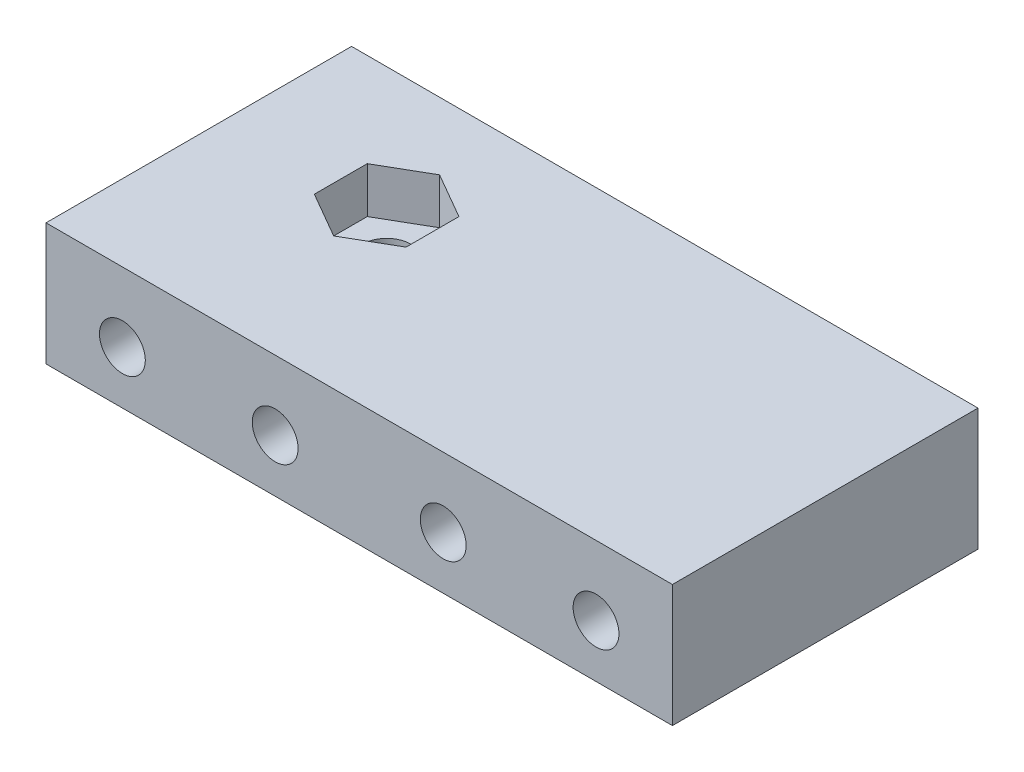
ISO-10303-21;
HEADER;
FILE_DESCRIPTION(('STEP AP214'),'2;1');
FILE_NAME('part.step','',(''),(''),'','','');
FILE_SCHEMA(('AUTOMOTIVE_DESIGN { 1 0 10303 214 1 1 1 1 }'));
ENDSEC;
DATA;
#1=APPLICATION_CONTEXT('core data for automotive mechanical design processes');
#2=APPLICATION_PROTOCOL_DEFINITION('international standard','automotive_design',2000,#1);
#3=PRODUCT_CONTEXT('',#1,'mechanical');
#4=PRODUCT('Part','Part','',(#3));
#5=PRODUCT_RELATED_PRODUCT_CATEGORY('part','',(#4));
#6=PRODUCT_DEFINITION_FORMATION('','',#4);
#7=PRODUCT_DEFINITION_CONTEXT('part definition',#1,'design');
#8=PRODUCT_DEFINITION('design','',#6,#7);
#9=PRODUCT_DEFINITION_SHAPE('','',#8);
#10=(LENGTH_UNIT() NAMED_UNIT(*) SI_UNIT(.MILLI.,.METRE.));
#11=(NAMED_UNIT(*) PLANE_ANGLE_UNIT() SI_UNIT($,.RADIAN.));
#12=(NAMED_UNIT(*) SI_UNIT($,.STERADIAN.) SOLID_ANGLE_UNIT());
#13=UNCERTAINTY_MEASURE_WITH_UNIT(LENGTH_MEASURE(1.E-05),#10,'distance_accuracy_value','');
#14=(GEOMETRIC_REPRESENTATION_CONTEXT(3) GLOBAL_UNCERTAINTY_ASSIGNED_CONTEXT((#13)) GLOBAL_UNIT_ASSIGNED_CONTEXT((#10,
#11,#12)) REPRESENTATION_CONTEXT('',''));
#15=CARTESIAN_POINT('',(0.,0.,0.));
#16=DIRECTION('',(0.,0.,1.));
#17=DIRECTION('',(1.,0.,0.));
#18=AXIS2_PLACEMENT_3D('',#15,#16,#17);
#19=CARTESIAN_POINT('',(10.16,8.,-12.135));
#20=DIRECTION('',(0.,-1.,0.));
#21=DIRECTION('',(0.,0.,-1.));
#22=AXIS2_PLACEMENT_3D('',#19,#20,#21);
#23=CYLINDRICAL_SURFACE('',#22,1.6);
#24=CARTESIAN_POINT('',(10.16,-2.5,-12.135));
#25=DIRECTION('',(0.,-1.,0.));
#26=DIRECTION('',(0.,0.,-1.));
#27=AXIS2_PLACEMENT_3D('',#24,#25,#26);
#28=CIRCLE('',#27,1.6);
#29=CARTESIAN_POINT('',(10.16,-2.5,-13.735));
#30=VERTEX_POINT('',#29);
#31=EDGE_CURVE('E173',#30,#30,#28,.T.);
#32=ORIENTED_EDGE('',*,*,#31,.T.);
#33=EDGE_LOOP('',(#32));
#34=FACE_BOUND('',#33,.T.);
#35=CARTESIAN_POINT('',(10.16,5.,-12.135));
#36=DIRECTION('',(0.,1.,0.));
#37=DIRECTION('',(0.,0.,1.));
#38=AXIS2_PLACEMENT_3D('',#35,#36,#37);
#39=CIRCLE('',#38,1.6);
#40=CARTESIAN_POINT('',(10.16,5.,-10.535));
#41=VERTEX_POINT('',#40);
#42=EDGE_CURVE('E36',#41,#41,#39,.T.);
#43=ORIENTED_EDGE('',*,*,#42,.T.);
#44=EDGE_LOOP('',(#43));
#45=FACE_BOUND('',#44,.T.);
#46=ADVANCED_FACE('F32',(#34,#45),#23,.F.);
#47=CARTESIAN_POINT('',(0.,0.,0.));
#48=DIRECTION('',(0.,-1.,0.));
#49=DIRECTION('',(0.,0.,-1.));
#50=AXIS2_PLACEMENT_3D('',#47,#48,#49);
#51=PLANE('',#50);
#52=DIRECTION('',(0.,0.,1.));
#53=VECTOR('',#52,1.);
#54=CARTESIAN_POINT('',(0.,0.,0.));
#55=LINE('',#54,#53);
#56=CARTESIAN_POINT('',(0.,0.,-20.));
#57=VERTEX_POINT('',#56);
#58=CARTESIAN_POINT('',(0.,0.,0.));
#59=VERTEX_POINT('',#58);
#60=EDGE_CURVE('E204',#57,#59,#55,.T.);
#61=ORIENTED_EDGE('',*,*,#60,.F.);
#62=DIRECTION('',(-1.,0.,0.));
#63=VECTOR('',#62,1.);
#64=CARTESIAN_POINT('',(0.,0.,-20.));
#65=LINE('',#64,#63);
#66=CARTESIAN_POINT('',(41.,0.,-20.));
#67=VERTEX_POINT('',#66);
#68=EDGE_CURVE('E78',#67,#57,#65,.T.);
#69=ORIENTED_EDGE('',*,*,#68,.F.);
#70=DIRECTION('',(0.,0.,-1.));
#71=VECTOR('',#70,1.);
#72=CARTESIAN_POINT('',(41.,0.,0.));
#73=LINE('',#72,#71);
#74=CARTESIAN_POINT('',(41.,0.,0.));
#75=VERTEX_POINT('',#74);
#76=EDGE_CURVE('E218',#75,#67,#73,.T.);
#77=ORIENTED_EDGE('',*,*,#76,.F.);
#78=DIRECTION('',(1.,0.,0.));
#79=VECTOR('',#78,1.);
#80=CARTESIAN_POINT('',(0.,0.,0.));
#81=LINE('',#80,#79);
#82=EDGE_CURVE('E216',#59,#75,#81,.T.);
#83=ORIENTED_EDGE('',*,*,#82,.F.);
#84=EDGE_LOOP('',(#61,#69,#77,#83));
#85=FACE_BOUND('',#84,.T.);
#86=CARTESIAN_POINT('',(10.16,0.,-12.135));
#87=DIRECTION('',(0.,-1.,0.));
#88=DIRECTION('',(0.,0.,-1.));
#89=AXIS2_PLACEMENT_3D('',#86,#87,#88);
#90=CIRCLE('',#89,3.5);
#91=CARTESIAN_POINT('',(10.16,0.,-15.635));
#92=VERTEX_POINT('',#91);
#93=EDGE_CURVE('E176',#92,#92,#90,.T.);
#94=ORIENTED_EDGE('',*,*,#93,.F.);
#95=EDGE_LOOP('',(#94));
#96=FACE_BOUND('',#95,.T.);
#97=ADVANCED_FACE('F232',(#85,#96),#51,.T.);
#98=CARTESIAN_POINT('',(0.,8.,0.));
#99=DIRECTION('',(1.,0.,0.));
#100=DIRECTION('',(0.,0.,-1.));
#101=AXIS2_PLACEMENT_3D('',#98,#99,#100);
#102=PLANE('',#101);
#103=ORIENTED_EDGE('',*,*,#60,.T.);
#104=DIRECTION('',(0.,-1.,0.));
#105=VECTOR('',#104,1.);
#106=CARTESIAN_POINT('',(0.,8.,0.));
#107=LINE('',#106,#105);
#108=CARTESIAN_POINT('',(0.,8.,0.));
#109=VERTEX_POINT('',#108);
#110=EDGE_CURVE('E11',#109,#59,#107,.T.);
#111=ORIENTED_EDGE('',*,*,#110,.F.);
#112=DIRECTION('',(0.,0.,1.));
#113=VECTOR('',#112,1.);
#114=CARTESIAN_POINT('',(0.,8.,0.));
#115=LINE('',#114,#113);
#116=CARTESIAN_POINT('',(0.,8.,-20.));
#117=VERTEX_POINT('',#116);
#118=EDGE_CURVE('E207',#117,#109,#115,.T.);
#119=ORIENTED_EDGE('',*,*,#118,.F.);
#120=DIRECTION('',(0.,-1.,0.));
#121=VECTOR('',#120,1.);
#122=CARTESIAN_POINT('',(0.,8.,-20.));
#123=LINE('',#122,#121);
#124=EDGE_CURVE('E213',#117,#57,#123,.T.);
#125=ORIENTED_EDGE('',*,*,#124,.T.);
#126=EDGE_LOOP('',(#103,#111,#119,#125));
#127=FACE_BOUND('',#126,.T.);
#128=ADVANCED_FACE('F34',(#127),#102,.F.);
#129=CARTESIAN_POINT('',(0.,8.,0.));
#130=DIRECTION('',(0.,0.,-1.));
#131=DIRECTION('',(-1.,0.,0.));
#132=AXIS2_PLACEMENT_3D('',#129,#130,#131);
#133=PLANE('',#132);
#134=CARTESIAN_POINT('',(36.,3.455,0.));
#135=DIRECTION('',(0.,0.,1.));
#136=DIRECTION('',(1.,0.,0.));
#137=AXIS2_PLACEMENT_3D('',#134,#135,#136);
#138=CIRCLE('',#137,1.5);
#139=CARTESIAN_POINT('',(37.5,3.455,0.));
#140=VERTEX_POINT('',#139);
#141=EDGE_CURVE('E180',#140,#140,#138,.T.);
#142=ORIENTED_EDGE('',*,*,#141,.F.);
#143=EDGE_LOOP('',(#142));
#144=FACE_BOUND('',#143,.T.);
#145=CARTESIAN_POINT('',(26.,3.455,0.));
#146=DIRECTION('',(0.,0.,1.));
#147=DIRECTION('',(1.,0.,0.));
#148=AXIS2_PLACEMENT_3D('',#145,#146,#147);
#149=CIRCLE('',#148,1.5);
#150=CARTESIAN_POINT('',(27.5,3.455,0.));
#151=VERTEX_POINT('',#150);
#152=EDGE_CURVE('E186',#151,#151,#149,.T.);
#153=ORIENTED_EDGE('',*,*,#152,.F.);
#154=EDGE_LOOP('',(#153));
#155=FACE_BOUND('',#154,.T.);
#156=CARTESIAN_POINT('',(15.,3.455,0.));
#157=DIRECTION('',(0.,0.,1.));
#158=DIRECTION('',(1.,0.,0.));
#159=AXIS2_PLACEMENT_3D('',#156,#157,#158);
#160=CIRCLE('',#159,1.5);
#161=CARTESIAN_POINT('',(16.5,3.455,0.));
#162=VERTEX_POINT('',#161);
#163=EDGE_CURVE('E192',#162,#162,#160,.T.);
#164=ORIENTED_EDGE('',*,*,#163,.F.);
#165=EDGE_LOOP('',(#164));
#166=FACE_BOUND('',#165,.T.);
#167=CARTESIAN_POINT('',(5.,3.455,0.));
#168=DIRECTION('',(0.,0.,1.));
#169=DIRECTION('',(1.,0.,0.));
#170=AXIS2_PLACEMENT_3D('',#167,#168,#169);
#171=CIRCLE('',#170,1.5);
#172=CARTESIAN_POINT('',(6.5,3.455,0.));
#173=VERTEX_POINT('',#172);
#174=EDGE_CURVE('E198',#173,#173,#171,.T.);
#175=ORIENTED_EDGE('',*,*,#174,.F.);
#176=EDGE_LOOP('',(#175));
#177=FACE_BOUND('',#176,.T.);
#178=ORIENTED_EDGE('',*,*,#82,.T.);
#179=DIRECTION('',(0.,-1.,0.));
#180=VECTOR('',#179,1.);
#181=CARTESIAN_POINT('',(41.,8.,0.));
#182=LINE('',#181,#180);
#183=CARTESIAN_POINT('',(41.,8.,0.));
#184=VERTEX_POINT('',#183);
#185=EDGE_CURVE('E41',#184,#75,#182,.T.);
#186=ORIENTED_EDGE('',*,*,#185,.F.);
#187=DIRECTION('',(1.,0.,0.));
#188=VECTOR('',#187,1.);
#189=CARTESIAN_POINT('',(0.,8.,0.));
#190=LINE('',#189,#188);
#191=EDGE_CURVE('E85',#109,#184,#190,.T.);
#192=ORIENTED_EDGE('',*,*,#191,.F.);
#193=ORIENTED_EDGE('',*,*,#110,.T.);
#194=EDGE_LOOP('',(#178,#186,#192,#193));
#195=FACE_BOUND('',#194,.T.);
#196=ADVANCED_FACE('F249',(#144,#155,#166,#177,#195),#133,.F.);
#197=CARTESIAN_POINT('',(41.,8.,0.));
#198=DIRECTION('',(-1.,0.,0.));
#199=DIRECTION('',(0.,0.,1.));
#200=AXIS2_PLACEMENT_3D('',#197,#198,#199);
#201=PLANE('',#200);
#202=ORIENTED_EDGE('',*,*,#76,.T.);
#203=DIRECTION('',(0.,-1.,0.));
#204=VECTOR('',#203,1.);
#205=CARTESIAN_POINT('',(41.,8.,-20.));
#206=LINE('',#205,#204);
#207=CARTESIAN_POINT('',(41.,8.,-20.));
#208=VERTEX_POINT('',#207);
#209=EDGE_CURVE('E222',#208,#67,#206,.T.);
#210=ORIENTED_EDGE('',*,*,#209,.F.);
#211=DIRECTION('',(0.,0.,-1.));
#212=VECTOR('',#211,1.);
#213=CARTESIAN_POINT('',(41.,8.,0.));
#214=LINE('',#213,#212);
#215=EDGE_CURVE('E210',#184,#208,#214,.T.);
#216=ORIENTED_EDGE('',*,*,#215,.F.);
#217=ORIENTED_EDGE('',*,*,#185,.T.);
#218=EDGE_LOOP('',(#202,#210,#216,#217));
#219=FACE_BOUND('',#218,.T.);
#220=ADVANCED_FACE('F228',(#219),#201,.F.);
#221=CARTESIAN_POINT('',(0.,8.,-20.));
#222=DIRECTION('',(0.,0.,1.));
#223=DIRECTION('',(1.,0.,0.));
#224=AXIS2_PLACEMENT_3D('',#221,#222,#223);
#225=PLANE('',#224);
#226=CARTESIAN_POINT('',(36.,3.455,-20.));
#227=DIRECTION('',(0.,0.,1.));
#228=DIRECTION('',(1.,0.,0.));
#229=AXIS2_PLACEMENT_3D('',#226,#227,#228);
#230=CIRCLE('',#229,1.5);
#231=CARTESIAN_POINT('',(37.5,3.455,-20.));
#232=VERTEX_POINT('',#231);
#233=EDGE_CURVE('E183',#232,#232,#230,.T.);
#234=ORIENTED_EDGE('',*,*,#233,.T.);
#235=EDGE_LOOP('',(#234));
#236=FACE_BOUND('',#235,.T.);
#237=CARTESIAN_POINT('',(26.,3.455,-20.));
#238=DIRECTION('',(0.,0.,1.));
#239=DIRECTION('',(1.,0.,0.));
#240=AXIS2_PLACEMENT_3D('',#237,#238,#239);
#241=CIRCLE('',#240,1.5);
#242=CARTESIAN_POINT('',(27.5,3.455,-20.));
#243=VERTEX_POINT('',#242);
#244=EDGE_CURVE('E189',#243,#243,#241,.T.);
#245=ORIENTED_EDGE('',*,*,#244,.T.);
#246=EDGE_LOOP('',(#245));
#247=FACE_BOUND('',#246,.T.);
#248=CARTESIAN_POINT('',(15.,3.455,-20.));
#249=DIRECTION('',(0.,0.,1.));
#250=DIRECTION('',(1.,0.,0.));
#251=AXIS2_PLACEMENT_3D('',#248,#249,#250);
#252=CIRCLE('',#251,1.5);
#253=CARTESIAN_POINT('',(16.5,3.455,-20.));
#254=VERTEX_POINT('',#253);
#255=EDGE_CURVE('E195',#254,#254,#252,.T.);
#256=ORIENTED_EDGE('',*,*,#255,.T.);
#257=EDGE_LOOP('',(#256));
#258=FACE_BOUND('',#257,.T.);
#259=CARTESIAN_POINT('',(5.,3.455,-20.));
#260=DIRECTION('',(0.,0.,1.));
#261=DIRECTION('',(1.,0.,0.));
#262=AXIS2_PLACEMENT_3D('',#259,#260,#261);
#263=CIRCLE('',#262,1.5);
#264=CARTESIAN_POINT('',(6.5,3.455,-20.));
#265=VERTEX_POINT('',#264);
#266=EDGE_CURVE('E201',#265,#265,#263,.T.);
#267=ORIENTED_EDGE('',*,*,#266,.T.);
#268=EDGE_LOOP('',(#267));
#269=FACE_BOUND('',#268,.T.);
#270=ORIENTED_EDGE('',*,*,#68,.T.);
#271=ORIENTED_EDGE('',*,*,#124,.F.);
#272=DIRECTION('',(-1.,0.,0.));
#273=VECTOR('',#272,1.);
#274=CARTESIAN_POINT('',(0.,8.,-20.));
#275=LINE('',#274,#273);
#276=EDGE_CURVE('E57',#208,#117,#275,.T.);
#277=ORIENTED_EDGE('',*,*,#276,.F.);
#278=ORIENTED_EDGE('',*,*,#209,.T.);
#279=EDGE_LOOP('',(#270,#271,#277,#278));
#280=FACE_BOUND('',#279,.T.);
#281=ADVANCED_FACE('F237',(#236,#247,#258,#269,#280),#225,.F.);
#282=CARTESIAN_POINT('',(0.,8.,0.));
#283=DIRECTION('',(0.,-1.,0.));
#284=DIRECTION('',(0.,0.,-1.));
#285=AXIS2_PLACEMENT_3D('',#282,#283,#284);
#286=PLANE('',#285);
#287=DIRECTION('',(0.866025403784439,0.,0.5));
#288=VECTOR('',#287,1.);
#289=CARTESIAN_POINT('',(7.16,8.,-10.4029491924311));
#290=LINE('',#289,#288);
#291=CARTESIAN_POINT('',(7.16,8.,-10.4029491924311));
#292=VERTEX_POINT('',#291);
#293=CARTESIAN_POINT('',(10.16,8.,-8.67089838486224));
#294=VERTEX_POINT('',#293);
#295=EDGE_CURVE('E154',#292,#294,#290,.T.);
#296=ORIENTED_EDGE('',*,*,#295,.F.);
#297=DIRECTION('',(0.,0.,1.));
#298=VECTOR('',#297,1.);
#299=CARTESIAN_POINT('',(7.16,8.,-13.8670508075689));
#300=LINE('',#299,#298);
#301=CARTESIAN_POINT('',(7.16,8.,-13.8670508075689));
#302=VERTEX_POINT('',#301);
#303=EDGE_CURVE('E48',#302,#292,#300,.T.);
#304=ORIENTED_EDGE('',*,*,#303,.F.);
#305=DIRECTION('',(-0.866025403784438,0.,0.5));
#306=VECTOR('',#305,1.);
#307=CARTESIAN_POINT('',(10.16,8.,-15.5991016151378));
#308=LINE('',#307,#306);
#309=CARTESIAN_POINT('',(10.16,8.,-15.5991016151378));
#310=VERTEX_POINT('',#309);
#311=EDGE_CURVE('E140',#310,#302,#308,.T.);
#312=ORIENTED_EDGE('',*,*,#311,.F.);
#313=DIRECTION('',(-0.866025403784439,0.,-0.5));
#314=VECTOR('',#313,1.);
#315=CARTESIAN_POINT('',(13.16,8.,-13.8670508075689));
#316=LINE('',#315,#314);
#317=CARTESIAN_POINT('',(13.16,8.,-13.8670508075689));
#318=VERTEX_POINT('',#317);
#319=EDGE_CURVE('E143',#318,#310,#316,.T.);
#320=ORIENTED_EDGE('',*,*,#319,.F.);
#321=DIRECTION('',(0.,0.,-1.));
#322=VECTOR('',#321,1.);
#323=CARTESIAN_POINT('',(13.16,8.,-10.4029491924311));
#324=LINE('',#323,#322);
#325=CARTESIAN_POINT('',(13.16,8.,-10.4029491924311));
#326=VERTEX_POINT('',#325);
#327=EDGE_CURVE('E159',#326,#318,#324,.T.);
#328=ORIENTED_EDGE('',*,*,#327,.F.);
#329=DIRECTION('',(0.866025403784438,0.,-0.5));
#330=VECTOR('',#329,1.);
#331=CARTESIAN_POINT('',(10.16,8.,-8.67089838486224));
#332=LINE('',#331,#330);
#333=EDGE_CURVE('E156',#294,#326,#332,.T.);
#334=ORIENTED_EDGE('',*,*,#333,.F.);
#335=EDGE_LOOP('',(#296,#304,#312,#320,#328,#334));
#336=FACE_BOUND('',#335,.T.);
#337=ORIENTED_EDGE('',*,*,#118,.T.);
#338=ORIENTED_EDGE('',*,*,#191,.T.);
#339=ORIENTED_EDGE('',*,*,#215,.T.);
#340=ORIENTED_EDGE('',*,*,#276,.T.);
#341=EDGE_LOOP('',(#337,#338,#339,#340));
#342=FACE_BOUND('',#341,.T.);
#343=ADVANCED_FACE('F239',(#336,#342),#286,.F.);
#344=CARTESIAN_POINT('',(5.,3.455,-20.));
#345=DIRECTION('',(0.,0.,1.));
#346=DIRECTION('',(1.,0.,0.));
#347=AXIS2_PLACEMENT_3D('',#344,#345,#346);
#348=CYLINDRICAL_SURFACE('',#347,1.5);
#349=ORIENTED_EDGE('',*,*,#266,.F.);
#350=EDGE_LOOP('',(#349));
#351=FACE_BOUND('',#350,.T.);
#352=ORIENTED_EDGE('',*,*,#174,.T.);
#353=EDGE_LOOP('',(#352));
#354=FACE_BOUND('',#353,.T.);
#355=ADVANCED_FACE('F246',(#351,#354),#348,.F.);
#356=CARTESIAN_POINT('',(15.,3.455,-20.));
#357=DIRECTION('',(0.,0.,1.));
#358=DIRECTION('',(1.,0.,0.));
#359=AXIS2_PLACEMENT_3D('',#356,#357,#358);
#360=CYLINDRICAL_SURFACE('',#359,1.5);
#361=ORIENTED_EDGE('',*,*,#255,.F.);
#362=EDGE_LOOP('',(#361));
#363=FACE_BOUND('',#362,.T.);
#364=ORIENTED_EDGE('',*,*,#163,.T.);
#365=EDGE_LOOP('',(#364));
#366=FACE_BOUND('',#365,.T.);
#367=ADVANCED_FACE('F272',(#363,#366),#360,.F.);
#368=CARTESIAN_POINT('',(26.,3.455,-20.));
#369=DIRECTION('',(0.,0.,1.));
#370=DIRECTION('',(1.,0.,0.));
#371=AXIS2_PLACEMENT_3D('',#368,#369,#370);
#372=CYLINDRICAL_SURFACE('',#371,1.5);
#373=ORIENTED_EDGE('',*,*,#244,.F.);
#374=EDGE_LOOP('',(#373));
#375=FACE_BOUND('',#374,.T.);
#376=ORIENTED_EDGE('',*,*,#152,.T.);
#377=EDGE_LOOP('',(#376));
#378=FACE_BOUND('',#377,.T.);
#379=ADVANCED_FACE('F268',(#375,#378),#372,.F.);
#380=CARTESIAN_POINT('',(36.,3.455,-20.));
#381=DIRECTION('',(0.,0.,1.));
#382=DIRECTION('',(1.,0.,0.));
#383=AXIS2_PLACEMENT_3D('',#380,#381,#382);
#384=CYLINDRICAL_SURFACE('',#383,1.5);
#385=ORIENTED_EDGE('',*,*,#233,.F.);
#386=EDGE_LOOP('',(#385));
#387=FACE_BOUND('',#386,.T.);
#388=ORIENTED_EDGE('',*,*,#141,.T.);
#389=EDGE_LOOP('',(#388));
#390=FACE_BOUND('',#389,.T.);
#391=ADVANCED_FACE('F264',(#387,#390),#384,.F.);
#392=CARTESIAN_POINT('',(10.16,-2.5,-12.135));
#393=DIRECTION('',(0.,-1.,0.));
#394=DIRECTION('',(0.,0.,-1.));
#395=AXIS2_PLACEMENT_3D('',#392,#393,#394);
#396=PLANE('',#395);
#397=CARTESIAN_POINT('',(10.16,-2.5,-12.135));
#398=DIRECTION('',(0.,-1.,0.));
#399=DIRECTION('',(0.,0.,-1.));
#400=AXIS2_PLACEMENT_3D('',#397,#398,#399);
#401=CIRCLE('',#400,3.5);
#402=CARTESIAN_POINT('',(10.16,-2.5,-15.635));
#403=VERTEX_POINT('',#402);
#404=EDGE_CURVE('E177',#403,#403,#401,.T.);
#405=ORIENTED_EDGE('',*,*,#404,.T.);
#406=EDGE_LOOP('',(#405));
#407=FACE_BOUND('',#406,.T.);
#408=ORIENTED_EDGE('',*,*,#31,.F.);
#409=EDGE_LOOP('',(#408));
#410=FACE_BOUND('',#409,.T.);
#411=ADVANCED_FACE('F267',(#407,#410),#396,.T.);
#412=CARTESIAN_POINT('',(10.16,-2.5,-12.135));
#413=DIRECTION('',(0.,1.,0.));
#414=DIRECTION('',(0.,0.,1.));
#415=AXIS2_PLACEMENT_3D('',#412,#413,#414);
#416=CYLINDRICAL_SURFACE('',#415,3.5);
#417=ORIENTED_EDGE('',*,*,#404,.F.);
#418=EDGE_LOOP('',(#417));
#419=FACE_BOUND('',#418,.T.);
#420=ORIENTED_EDGE('',*,*,#93,.T.);
#421=EDGE_LOOP('',(#420));
#422=FACE_BOUND('',#421,.T.);
#423=ADVANCED_FACE('F262',(#419,#422),#416,.T.);
#424=CARTESIAN_POINT('',(7.16,5.,-13.8670508075689));
#425=DIRECTION('',(-1.,0.,0.));
#426=DIRECTION('',(0.,0.,1.));
#427=AXIS2_PLACEMENT_3D('',#424,#425,#426);
#428=PLANE('',#427);
#429=ORIENTED_EDGE('',*,*,#303,.T.);
#430=DIRECTION('',(0.,1.,0.));
#431=VECTOR('',#430,1.);
#432=CARTESIAN_POINT('',(7.16,5.,-10.4029491924311));
#433=LINE('',#432,#431);
#434=CARTESIAN_POINT('',(7.16,5.,-10.4029491924311));
#435=VERTEX_POINT('',#434);
#436=EDGE_CURVE('E117',#435,#292,#433,.T.);
#437=ORIENTED_EDGE('',*,*,#436,.F.);
#438=DIRECTION('',(0.,0.,1.));
#439=VECTOR('',#438,1.);
#440=CARTESIAN_POINT('',(7.16,5.,-13.8670508075689));
#441=LINE('',#440,#439);
#442=CARTESIAN_POINT('',(7.16,5.,-13.8670508075689));
#443=VERTEX_POINT('',#442);
#444=EDGE_CURVE('E121',#443,#435,#441,.T.);
#445=ORIENTED_EDGE('',*,*,#444,.F.);
#446=DIRECTION('',(0.,1.,0.));
#447=VECTOR('',#446,1.);
#448=CARTESIAN_POINT('',(7.16,5.,-13.8670508075689));
#449=LINE('',#448,#447);
#450=EDGE_CURVE('E164',#443,#302,#449,.T.);
#451=ORIENTED_EDGE('',*,*,#450,.T.);
#452=EDGE_LOOP('',(#429,#437,#445,#451));
#453=FACE_BOUND('',#452,.T.);
#454=ADVANCED_FACE('F119',(#453),#428,.F.);
#455=CARTESIAN_POINT('',(10.16,5.,-15.5991016151378));
#456=DIRECTION('',(-0.5,0.,-0.866025403784438));
#457=DIRECTION('',(-0.866025403784439,0.,0.5));
#458=AXIS2_PLACEMENT_3D('',#455,#456,#457);
#459=PLANE('',#458);
#460=ORIENTED_EDGE('',*,*,#311,.T.);
#461=ORIENTED_EDGE('',*,*,#450,.F.);
#462=DIRECTION('',(-0.866025403784438,0.,0.5));
#463=VECTOR('',#462,1.);
#464=CARTESIAN_POINT('',(10.16,5.,-15.5991016151378));
#465=LINE('',#464,#463);
#466=CARTESIAN_POINT('',(10.16,5.,-15.5991016151378));
#467=VERTEX_POINT('',#466);
#468=EDGE_CURVE('E127',#467,#443,#465,.T.);
#469=ORIENTED_EDGE('',*,*,#468,.F.);
#470=DIRECTION('',(0.,1.,0.));
#471=VECTOR('',#470,1.);
#472=CARTESIAN_POINT('',(10.16,5.,-15.5991016151378));
#473=LINE('',#472,#471);
#474=EDGE_CURVE('E166',#467,#310,#473,.T.);
#475=ORIENTED_EDGE('',*,*,#474,.T.);
#476=EDGE_LOOP('',(#460,#461,#469,#475));
#477=FACE_BOUND('',#476,.T.);
#478=ADVANCED_FACE('F346',(#477),#459,.F.);
#479=CARTESIAN_POINT('',(13.16,5.,-13.8670508075689));
#480=DIRECTION('',(0.499999999999999,0.,-0.866025403784439));
#481=DIRECTION('',(-0.866025403784439,0.,-0.5));
#482=AXIS2_PLACEMENT_3D('',#479,#480,#481);
#483=PLANE('',#482);
#484=ORIENTED_EDGE('',*,*,#319,.T.);
#485=ORIENTED_EDGE('',*,*,#474,.F.);
#486=DIRECTION('',(-0.866025403784439,0.,-0.5));
#487=VECTOR('',#486,1.);
#488=CARTESIAN_POINT('',(13.16,5.,-13.8670508075689));
#489=LINE('',#488,#487);
#490=CARTESIAN_POINT('',(13.16,5.,-13.8670508075689));
#491=VERTEX_POINT('',#490);
#492=EDGE_CURVE('E150',#491,#467,#489,.T.);
#493=ORIENTED_EDGE('',*,*,#492,.F.);
#494=DIRECTION('',(0.,1.,0.));
#495=VECTOR('',#494,1.);
#496=CARTESIAN_POINT('',(13.16,5.,-13.8670508075689));
#497=LINE('',#496,#495);
#498=EDGE_CURVE('E168',#491,#318,#497,.T.);
#499=ORIENTED_EDGE('',*,*,#498,.T.);
#500=EDGE_LOOP('',(#484,#485,#493,#499));
#501=FACE_BOUND('',#500,.T.);
#502=ADVANCED_FACE('F355',(#501),#483,.F.);
#503=CARTESIAN_POINT('',(13.16,5.,-10.4029491924311));
#504=DIRECTION('',(1.,0.,0.));
#505=DIRECTION('',(0.,0.,-1.));
#506=AXIS2_PLACEMENT_3D('',#503,#504,#505);
#507=PLANE('',#506);
#508=ORIENTED_EDGE('',*,*,#327,.T.);
#509=ORIENTED_EDGE('',*,*,#498,.F.);
#510=DIRECTION('',(0.,0.,-1.));
#511=VECTOR('',#510,1.);
#512=CARTESIAN_POINT('',(13.16,5.,-10.4029491924311));
#513=LINE('',#512,#511);
#514=CARTESIAN_POINT('',(13.16,5.,-10.4029491924311));
#515=VERTEX_POINT('',#514);
#516=EDGE_CURVE('E147',#515,#491,#513,.T.);
#517=ORIENTED_EDGE('',*,*,#516,.F.);
#518=DIRECTION('',(0.,1.,0.));
#519=VECTOR('',#518,1.);
#520=CARTESIAN_POINT('',(13.16,5.,-10.4029491924311));
#521=LINE('',#520,#519);
#522=EDGE_CURVE('E170',#515,#326,#521,.T.);
#523=ORIENTED_EDGE('',*,*,#522,.T.);
#524=EDGE_LOOP('',(#508,#509,#517,#523));
#525=FACE_BOUND('',#524,.T.);
#526=ADVANCED_FACE('F365',(#525),#507,.F.);
#527=CARTESIAN_POINT('',(10.16,5.,-8.67089838486224));
#528=DIRECTION('',(0.5,0.,0.866025403784439));
#529=DIRECTION('',(0.866025403784439,0.,-0.5));
#530=AXIS2_PLACEMENT_3D('',#527,#528,#529);
#531=PLANE('',#530);
#532=ORIENTED_EDGE('',*,*,#333,.T.);
#533=ORIENTED_EDGE('',*,*,#522,.F.);
#534=DIRECTION('',(0.866025403784438,0.,-0.5));
#535=VECTOR('',#534,1.);
#536=CARTESIAN_POINT('',(10.16,5.,-8.67089838486224));
#537=LINE('',#536,#535);
#538=CARTESIAN_POINT('',(10.16,5.,-8.67089838486224));
#539=VERTEX_POINT('',#538);
#540=EDGE_CURVE('E135',#539,#515,#537,.T.);
#541=ORIENTED_EDGE('',*,*,#540,.F.);
#542=DIRECTION('',(0.,1.,0.));
#543=VECTOR('',#542,1.);
#544=CARTESIAN_POINT('',(10.16,5.,-8.67089838486224));
#545=LINE('',#544,#543);
#546=EDGE_CURVE('E126',#539,#294,#545,.T.);
#547=ORIENTED_EDGE('',*,*,#546,.T.);
#548=EDGE_LOOP('',(#532,#533,#541,#547));
#549=FACE_BOUND('',#548,.T.);
#550=ADVANCED_FACE('F375',(#549),#531,.F.);
#551=CARTESIAN_POINT('',(7.16,5.,-10.4029491924311));
#552=DIRECTION('',(-0.5,0.,0.866025403784439));
#553=DIRECTION('',(0.866025403784439,0.,0.5));
#554=AXIS2_PLACEMENT_3D('',#551,#552,#553);
#555=PLANE('',#554);
#556=ORIENTED_EDGE('',*,*,#295,.T.);
#557=ORIENTED_EDGE('',*,*,#546,.F.);
#558=DIRECTION('',(0.866025403784439,0.,0.5));
#559=VECTOR('',#558,1.);
#560=CARTESIAN_POINT('',(7.16,5.,-10.4029491924311));
#561=LINE('',#560,#559);
#562=EDGE_CURVE('E130',#435,#539,#561,.T.);
#563=ORIENTED_EDGE('',*,*,#562,.F.);
#564=ORIENTED_EDGE('',*,*,#436,.T.);
#565=EDGE_LOOP('',(#556,#557,#563,#564));
#566=FACE_BOUND('',#565,.T.);
#567=ADVANCED_FACE('F131',(#566),#555,.F.);
#568=CARTESIAN_POINT('',(0.,5.,0.));
#569=DIRECTION('',(0.,1.,0.));
#570=DIRECTION('',(0.,0.,1.));
#571=AXIS2_PLACEMENT_3D('',#568,#569,#570);
#572=PLANE('',#571);
#573=ORIENTED_EDGE('',*,*,#42,.F.);
#574=EDGE_LOOP('',(#573));
#575=FACE_BOUND('',#574,.T.);
#576=ORIENTED_EDGE('',*,*,#444,.T.);
#577=ORIENTED_EDGE('',*,*,#562,.T.);
#578=ORIENTED_EDGE('',*,*,#540,.T.);
#579=ORIENTED_EDGE('',*,*,#516,.T.);
#580=ORIENTED_EDGE('',*,*,#492,.T.);
#581=ORIENTED_EDGE('',*,*,#468,.T.);
#582=EDGE_LOOP('',(#576,#577,#578,#579,#580,#581));
#583=FACE_BOUND('',#582,.T.);
#584=ADVANCED_FACE('F137',(#575,#583),#572,.T.);
#585=CLOSED_SHELL('',(#46,#97,#128,#196,#220,#281,#343,#355,#367,#379,#391,#411,#423,#454,#478,
#502,#526,#550,#567,#584));
#586=MANIFOLD_SOLID_BREP('B2',#585);
#587=ADVANCED_BREP_SHAPE_REPRESENTATION('',(#18,#586),#14);
#588=SHAPE_DEFINITION_REPRESENTATION(#9,#587);
ENDSEC;
END-ISO-10303-21;
